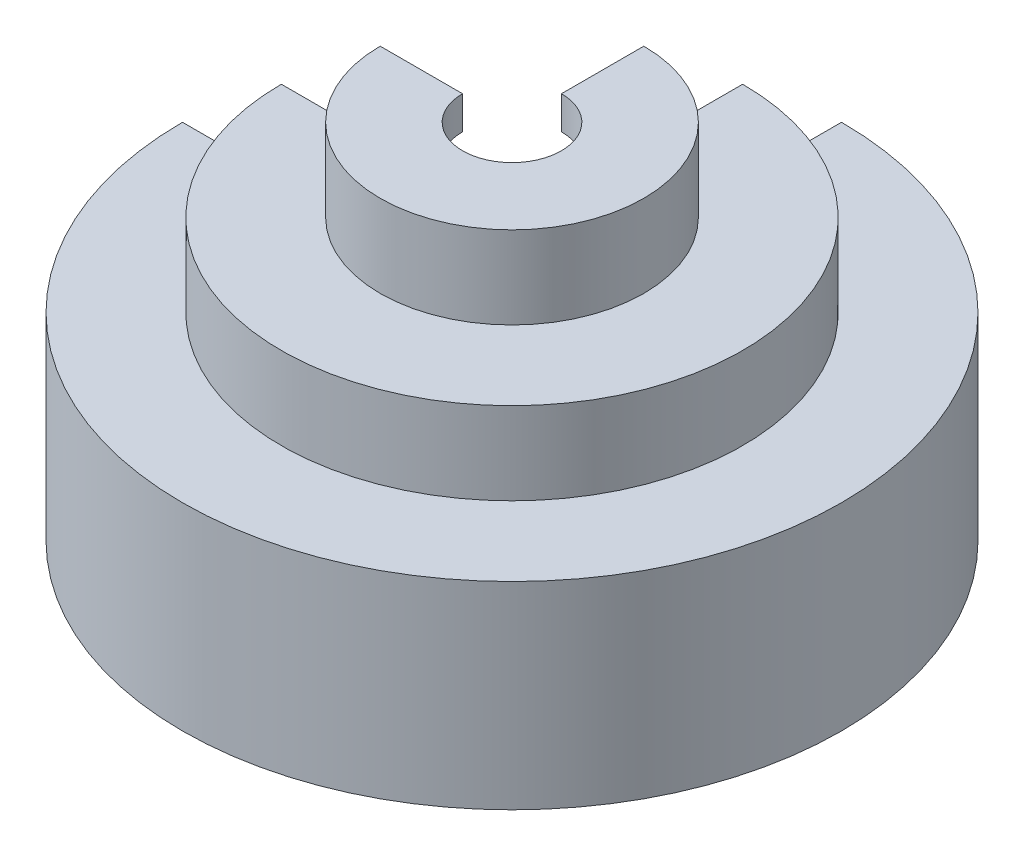
ISO-10303-21;
HEADER;
FILE_DESCRIPTION(('STEP AP214'),'2;1');
FILE_NAME('part.step','',(''),(''),'','','');
FILE_SCHEMA(('AUTOMOTIVE_DESIGN { 1 0 10303 214 1 1 1 1 }'));
ENDSEC;
DATA;
#1=APPLICATION_CONTEXT('core data for automotive mechanical design processes');
#2=APPLICATION_PROTOCOL_DEFINITION('international standard','automotive_design',2000,#1);
#3=PRODUCT_CONTEXT('',#1,'mechanical');
#4=PRODUCT('Part','Part','',(#3));
#5=PRODUCT_RELATED_PRODUCT_CATEGORY('part','',(#4));
#6=PRODUCT_DEFINITION_FORMATION('','',#4);
#7=PRODUCT_DEFINITION_CONTEXT('part definition',#1,'design');
#8=PRODUCT_DEFINITION('design','',#6,#7);
#9=PRODUCT_DEFINITION_SHAPE('','',#8);
#10=(LENGTH_UNIT() NAMED_UNIT(*) SI_UNIT(.MILLI.,.METRE.));
#11=(NAMED_UNIT(*) PLANE_ANGLE_UNIT() SI_UNIT($,.RADIAN.));
#12=(NAMED_UNIT(*) SI_UNIT($,.STERADIAN.) SOLID_ANGLE_UNIT());
#13=UNCERTAINTY_MEASURE_WITH_UNIT(LENGTH_MEASURE(1.E-05),#10,'distance_accuracy_value','');
#14=(GEOMETRIC_REPRESENTATION_CONTEXT(3) GLOBAL_UNCERTAINTY_ASSIGNED_CONTEXT((#13)) GLOBAL_UNIT_ASSIGNED_CONTEXT((#10,
#11,#12)) REPRESENTATION_CONTEXT('',''));
#15=CARTESIAN_POINT('',(0.,0.,0.));
#16=DIRECTION('',(0.,0.,1.));
#17=DIRECTION('',(1.,0.,0.));
#18=AXIS2_PLACEMENT_3D('',#15,#16,#17);
#19=CARTESIAN_POINT('',(0.,-150.,0.));
#20=DIRECTION('',(0.,-1.,0.));
#21=DIRECTION('',(0.,0.,-1.));
#22=AXIS2_PLACEMENT_3D('',#19,#20,#21);
#23=CYLINDRICAL_SURFACE('',#22,30.);
#24=CARTESIAN_POINT('',(0.,150.,0.));
#25=DIRECTION('',(0.,-1.,0.));
#26=DIRECTION('',(0.,0.,-1.));
#27=AXIS2_PLACEMENT_3D('',#24,#25,#26);
#28=CIRCLE('',#27,30.);
#29=CARTESIAN_POINT('',(0.,150.,-30.));
#30=VERTEX_POINT('',#29);
#31=CARTESIAN_POINT('',(-30.,150.,0.));
#32=VERTEX_POINT('',#31);
#33=EDGE_CURVE('E172',#30,#32,#28,.T.);
#34=ORIENTED_EDGE('',*,*,#33,.F.);
#35=DIRECTION('',(0.,-1.,0.));
#36=VECTOR('',#35,1.);
#37=CARTESIAN_POINT('',(0.,-150.,-30.));
#38=LINE('',#37,#36);
#39=CARTESIAN_POINT('',(0.,130.,-30.));
#40=VERTEX_POINT('',#39);
#41=EDGE_CURVE('E196',#30,#40,#38,.T.);
#42=ORIENTED_EDGE('',*,*,#41,.T.);
#43=CARTESIAN_POINT('',(0.,130.,0.));
#44=DIRECTION('',(0.,-1.,0.));
#45=DIRECTION('',(0.,0.,-1.));
#46=AXIS2_PLACEMENT_3D('',#43,#44,#45);
#47=CIRCLE('',#46,30.);
#48=CARTESIAN_POINT('',(-30.,130.,0.));
#49=VERTEX_POINT('',#48);
#50=EDGE_CURVE('E190',#40,#49,#47,.T.);
#51=ORIENTED_EDGE('',*,*,#50,.T.);
#52=DIRECTION('',(0.,-1.,0.));
#53=VECTOR('',#52,1.);
#54=CARTESIAN_POINT('',(-30.,-150.,0.));
#55=LINE('',#54,#53);
#56=EDGE_CURVE('E54',#49,#32,#55,.F.);
#57=ORIENTED_EDGE('',*,*,#56,.T.);
#58=EDGE_LOOP('',(#34,#42,#51,#57));
#59=FACE_BOUND('',#58,.T.);
#60=ADVANCED_FACE('F33',(#59),#23,.F.);
#61=CARTESIAN_POINT('',(-30.,150.,0.));
#62=DIRECTION('',(0.,-1.,0.));
#63=DIRECTION('',(0.,0.,-1.));
#64=AXIS2_PLACEMENT_3D('',#61,#62,#63);
#65=PLANE('',#64);
#66=CARTESIAN_POINT('',(0.,150.,0.));
#67=DIRECTION('',(0.,-1.,0.));
#68=DIRECTION('',(0.,0.,-1.));
#69=AXIS2_PLACEMENT_3D('',#66,#67,#68);
#70=CIRCLE('',#69,80.);
#71=CARTESIAN_POINT('',(0.,150.,-80.));
#72=VERTEX_POINT('',#71);
#73=CARTESIAN_POINT('',(-80.,150.,0.));
#74=VERTEX_POINT('',#73);
#75=EDGE_CURVE('E170',#72,#74,#70,.T.);
#76=ORIENTED_EDGE('',*,*,#75,.F.);
#77=DIRECTION('',(0.,0.,-1.));
#78=VECTOR('',#77,1.);
#79=CARTESIAN_POINT('',(0.,150.,-207.466179174207));
#80=LINE('',#79,#78);
#81=EDGE_CURVE('E174',#30,#72,#80,.T.);
#82=ORIENTED_EDGE('',*,*,#81,.F.);
#83=ORIENTED_EDGE('',*,*,#33,.T.);
#84=DIRECTION('',(1.,0.,0.));
#85=VECTOR('',#84,1.);
#86=CARTESIAN_POINT('',(0.,150.,0.));
#87=LINE('',#86,#85);
#88=EDGE_CURVE('E157',#74,#32,#87,.T.);
#89=ORIENTED_EDGE('',*,*,#88,.F.);
#90=EDGE_LOOP('',(#76,#82,#83,#89));
#91=FACE_BOUND('',#90,.T.);
#92=ADVANCED_FACE('F168',(#91),#65,.F.);
#93=CARTESIAN_POINT('',(0.,-150.,0.));
#94=DIRECTION('',(0.,-1.,0.));
#95=DIRECTION('',(0.,0.,-1.));
#96=AXIS2_PLACEMENT_3D('',#93,#94,#95);
#97=CYLINDRICAL_SURFACE('',#96,80.);
#98=CARTESIAN_POINT('',(0.,100.,0.));
#99=DIRECTION('',(0.,-1.,0.));
#100=DIRECTION('',(0.,0.,-1.));
#101=AXIS2_PLACEMENT_3D('',#98,#99,#100);
#102=CIRCLE('',#101,80.);
#103=CARTESIAN_POINT('',(0.,100.,-80.));
#104=VERTEX_POINT('',#103);
#105=CARTESIAN_POINT('',(-80.,100.,0.));
#106=VERTEX_POINT('',#105);
#107=EDGE_CURVE('E179',#104,#106,#102,.T.);
#108=ORIENTED_EDGE('',*,*,#107,.F.);
#109=DIRECTION('',(0.,-1.,0.));
#110=VECTOR('',#109,1.);
#111=CARTESIAN_POINT('',(0.,-150.,-80.));
#112=LINE('',#111,#110);
#113=EDGE_CURVE('E178',#104,#72,#112,.F.);
#114=ORIENTED_EDGE('',*,*,#113,.T.);
#115=ORIENTED_EDGE('',*,*,#75,.T.);
#116=DIRECTION('',(0.,-1.,0.));
#117=VECTOR('',#116,1.);
#118=CARTESIAN_POINT('',(-80.,-150.,0.));
#119=LINE('',#118,#117);
#120=EDGE_CURVE('E154',#74,#106,#119,.T.);
#121=ORIENTED_EDGE('',*,*,#120,.T.);
#122=EDGE_LOOP('',(#108,#114,#115,#121));
#123=FACE_BOUND('',#122,.T.);
#124=ADVANCED_FACE('F177',(#123),#97,.T.);
#125=CARTESIAN_POINT('',(-80.,100.,0.));
#126=DIRECTION('',(0.,-1.,0.));
#127=DIRECTION('',(0.,0.,-1.));
#128=AXIS2_PLACEMENT_3D('',#125,#126,#127);
#129=PLANE('',#128);
#130=CARTESIAN_POINT('',(0.,100.,0.));
#131=DIRECTION('',(0.,-1.,0.));
#132=DIRECTION('',(0.,0.,-1.));
#133=AXIS2_PLACEMENT_3D('',#130,#131,#132);
#134=CIRCLE('',#133,140.);
#135=CARTESIAN_POINT('',(0.,100.,-140.));
#136=VERTEX_POINT('',#135);
#137=CARTESIAN_POINT('',(-140.,100.,0.));
#138=VERTEX_POINT('',#137);
#139=EDGE_CURVE('E182',#136,#138,#134,.T.);
#140=ORIENTED_EDGE('',*,*,#139,.F.);
#141=DIRECTION('',(0.,0.,1.));
#142=VECTOR('',#141,1.);
#143=CARTESIAN_POINT('',(0.,100.,0.));
#144=LINE('',#143,#142);
#145=EDGE_CURVE('E200',#136,#104,#144,.T.);
#146=ORIENTED_EDGE('',*,*,#145,.T.);
#147=ORIENTED_EDGE('',*,*,#107,.T.);
#148=DIRECTION('',(-1.,0.,0.));
#149=VECTOR('',#148,1.);
#150=CARTESIAN_POINT('',(-80.,100.,0.));
#151=LINE('',#150,#149);
#152=EDGE_CURVE('E159',#106,#138,#151,.T.);
#153=ORIENTED_EDGE('',*,*,#152,.T.);
#154=EDGE_LOOP('',(#140,#146,#147,#153));
#155=FACE_BOUND('',#154,.T.);
#156=ADVANCED_FACE('F249',(#155),#129,.F.);
#157=CARTESIAN_POINT('',(0.,-150.,0.));
#158=DIRECTION('',(0.,-1.,0.));
#159=DIRECTION('',(0.,0.,-1.));
#160=AXIS2_PLACEMENT_3D('',#157,#158,#159);
#161=CYLINDRICAL_SURFACE('',#160,140.);
#162=CARTESIAN_POINT('',(0.,50.,0.));
#163=DIRECTION('',(0.,-1.,0.));
#164=DIRECTION('',(0.,0.,-1.));
#165=AXIS2_PLACEMENT_3D('',#162,#163,#164);
#166=CIRCLE('',#165,140.);
#167=CARTESIAN_POINT('',(0.,50.,-140.));
#168=VERTEX_POINT('',#167);
#169=CARTESIAN_POINT('',(-140.,50.,0.));
#170=VERTEX_POINT('',#169);
#171=EDGE_CURVE('E236',#168,#170,#166,.T.);
#172=ORIENTED_EDGE('',*,*,#171,.F.);
#173=DIRECTION('',(0.,-1.,0.));
#174=VECTOR('',#173,1.);
#175=CARTESIAN_POINT('',(0.,-150.,-140.));
#176=LINE('',#175,#174);
#177=EDGE_CURVE('E246',#168,#136,#176,.F.);
#178=ORIENTED_EDGE('',*,*,#177,.T.);
#179=ORIENTED_EDGE('',*,*,#139,.T.);
#180=DIRECTION('',(0.,-1.,0.));
#181=VECTOR('',#180,1.);
#182=CARTESIAN_POINT('',(-140.,-150.,0.));
#183=LINE('',#182,#181);
#184=EDGE_CURVE('E245',#138,#170,#183,.T.);
#185=ORIENTED_EDGE('',*,*,#184,.T.);
#186=EDGE_LOOP('',(#172,#178,#179,#185));
#187=FACE_BOUND('',#186,.T.);
#188=ADVANCED_FACE('F244',(#187),#161,.T.);
#189=CARTESIAN_POINT('',(-140.,50.,0.));
#190=DIRECTION('',(0.,-1.,0.));
#191=DIRECTION('',(0.,0.,-1.));
#192=AXIS2_PLACEMENT_3D('',#189,#190,#191);
#193=PLANE('',#192);
#194=CARTESIAN_POINT('',(0.,50.,0.));
#195=DIRECTION('',(0.,-1.,0.));
#196=DIRECTION('',(0.,0.,-1.));
#197=AXIS2_PLACEMENT_3D('',#194,#195,#196);
#198=CIRCLE('',#197,200.);
#199=CARTESIAN_POINT('',(0.,50.,-200.));
#200=VERTEX_POINT('',#199);
#201=CARTESIAN_POINT('',(-200.,50.,0.));
#202=VERTEX_POINT('',#201);
#203=EDGE_CURVE('E233',#200,#202,#198,.T.);
#204=ORIENTED_EDGE('',*,*,#203,.F.);
#205=DIRECTION('',(0.,0.,1.));
#206=VECTOR('',#205,1.);
#207=CARTESIAN_POINT('',(0.,50.,0.));
#208=LINE('',#207,#206);
#209=EDGE_CURVE('E284',#200,#168,#208,.T.);
#210=ORIENTED_EDGE('',*,*,#209,.T.);
#211=ORIENTED_EDGE('',*,*,#171,.T.);
#212=DIRECTION('',(-1.,0.,0.));
#213=VECTOR('',#212,1.);
#214=CARTESIAN_POINT('',(-140.,50.,0.));
#215=LINE('',#214,#213);
#216=EDGE_CURVE('E251',#170,#202,#215,.T.);
#217=ORIENTED_EDGE('',*,*,#216,.T.);
#218=EDGE_LOOP('',(#204,#210,#211,#217));
#219=FACE_BOUND('',#218,.T.);
#220=ADVANCED_FACE('F289',(#219),#193,.F.);
#221=CARTESIAN_POINT('',(0.,-150.,0.));
#222=DIRECTION('',(0.,-1.,0.));
#223=DIRECTION('',(0.,0.,-1.));
#224=AXIS2_PLACEMENT_3D('',#221,#222,#223);
#225=CYLINDRICAL_SURFACE('',#224,200.);
#226=CARTESIAN_POINT('',(0.,-70.,0.));
#227=DIRECTION('',(0.,-1.,0.));
#228=DIRECTION('',(0.,0.,-1.));
#229=AXIS2_PLACEMENT_3D('',#226,#227,#228);
#230=CIRCLE('',#229,200.);
#231=CARTESIAN_POINT('',(0.,-70.,-200.));
#232=VERTEX_POINT('',#231);
#233=CARTESIAN_POINT('',(-200.,-70.,0.));
#234=VERTEX_POINT('',#233);
#235=EDGE_CURVE('E230',#232,#234,#230,.T.);
#236=ORIENTED_EDGE('',*,*,#235,.F.);
#237=DIRECTION('',(0.,-1.,0.));
#238=VECTOR('',#237,1.);
#239=CARTESIAN_POINT('',(0.,-150.,-200.));
#240=LINE('',#239,#238);
#241=EDGE_CURVE('E281',#232,#200,#240,.F.);
#242=ORIENTED_EDGE('',*,*,#241,.T.);
#243=ORIENTED_EDGE('',*,*,#203,.T.);
#244=DIRECTION('',(0.,-1.,0.));
#245=VECTOR('',#244,1.);
#246=CARTESIAN_POINT('',(-200.,-150.,0.));
#247=LINE('',#246,#245);
#248=EDGE_CURVE('E296',#202,#234,#247,.T.);
#249=ORIENTED_EDGE('',*,*,#248,.T.);
#250=EDGE_LOOP('',(#236,#242,#243,#249));
#251=FACE_BOUND('',#250,.T.);
#252=ADVANCED_FACE('F294',(#251),#225,.T.);
#253=CARTESIAN_POINT('',(-200.,-70.,0.));
#254=DIRECTION('',(0.,1.,0.));
#255=DIRECTION('',(0.,0.,1.));
#256=AXIS2_PLACEMENT_3D('',#253,#254,#255);
#257=PLANE('',#256);
#258=CARTESIAN_POINT('',(0.,-70.,0.));
#259=DIRECTION('',(0.,-1.,0.));
#260=DIRECTION('',(0.,0.,-1.));
#261=AXIS2_PLACEMENT_3D('',#258,#259,#260);
#262=CIRCLE('',#261,80.);
#263=CARTESIAN_POINT('',(0.,-70.,-80.));
#264=VERTEX_POINT('',#263);
#265=CARTESIAN_POINT('',(-80.,-70.,0.));
#266=VERTEX_POINT('',#265);
#267=EDGE_CURVE('E227',#264,#266,#262,.T.);
#268=ORIENTED_EDGE('',*,*,#267,.F.);
#269=DIRECTION('',(0.,0.,-1.));
#270=VECTOR('',#269,1.);
#271=CARTESIAN_POINT('',(0.,-70.,0.));
#272=LINE('',#271,#270);
#273=EDGE_CURVE('E278',#264,#232,#272,.T.);
#274=ORIENTED_EDGE('',*,*,#273,.T.);
#275=ORIENTED_EDGE('',*,*,#235,.T.);
#276=DIRECTION('',(1.,0.,0.));
#277=VECTOR('',#276,1.);
#278=CARTESIAN_POINT('',(-200.,-70.,0.));
#279=LINE('',#278,#277);
#280=EDGE_CURVE('E301',#234,#266,#279,.T.);
#281=ORIENTED_EDGE('',*,*,#280,.T.);
#282=EDGE_LOOP('',(#268,#274,#275,#281));
#283=FACE_BOUND('',#282,.T.);
#284=ADVANCED_FACE('F300',(#283),#257,.F.);
#285=CARTESIAN_POINT('',(0.,-150.,0.));
#286=DIRECTION('',(0.,-1.,0.));
#287=DIRECTION('',(0.,0.,-1.));
#288=AXIS2_PLACEMENT_3D('',#285,#286,#287);
#289=CYLINDRICAL_SURFACE('',#288,80.);
#290=CARTESIAN_POINT('',(0.,-150.,0.));
#291=DIRECTION('',(0.,-1.,0.));
#292=DIRECTION('',(0.,0.,-1.));
#293=AXIS2_PLACEMENT_3D('',#290,#291,#292);
#294=CIRCLE('',#293,80.);
#295=CARTESIAN_POINT('',(0.,-150.,-80.));
#296=VERTEX_POINT('',#295);
#297=CARTESIAN_POINT('',(-80.,-150.,0.));
#298=VERTEX_POINT('',#297);
#299=EDGE_CURVE('E224',#296,#298,#294,.T.);
#300=ORIENTED_EDGE('',*,*,#299,.F.);
#301=DIRECTION('',(0.,-1.,0.));
#302=VECTOR('',#301,1.);
#303=CARTESIAN_POINT('',(0.,-150.,-80.));
#304=LINE('',#303,#302);
#305=EDGE_CURVE('E275',#296,#264,#304,.F.);
#306=ORIENTED_EDGE('',*,*,#305,.T.);
#307=ORIENTED_EDGE('',*,*,#267,.T.);
#308=DIRECTION('',(0.,-1.,0.));
#309=VECTOR('',#308,1.);
#310=CARTESIAN_POINT('',(-80.,-150.,0.));
#311=LINE('',#310,#309);
#312=EDGE_CURVE('E307',#266,#298,#311,.T.);
#313=ORIENTED_EDGE('',*,*,#312,.T.);
#314=EDGE_LOOP('',(#300,#306,#307,#313));
#315=FACE_BOUND('',#314,.T.);
#316=ADVANCED_FACE('F305',(#315),#289,.T.);
#317=CARTESIAN_POINT('',(-80.,-150.,0.));
#318=DIRECTION('',(0.,1.,0.));
#319=DIRECTION('',(0.,0.,1.));
#320=AXIS2_PLACEMENT_3D('',#317,#318,#319);
#321=PLANE('',#320);
#322=CARTESIAN_POINT('',(0.,-150.,0.));
#323=DIRECTION('',(0.,-1.,0.));
#324=DIRECTION('',(0.,0.,-1.));
#325=AXIS2_PLACEMENT_3D('',#322,#323,#324);
#326=CIRCLE('',#325,40.);
#327=CARTESIAN_POINT('',(0.,-150.,-40.));
#328=VERTEX_POINT('',#327);
#329=CARTESIAN_POINT('',(-40.,-150.,0.));
#330=VERTEX_POINT('',#329);
#331=EDGE_CURVE('E221',#328,#330,#326,.T.);
#332=ORIENTED_EDGE('',*,*,#331,.F.);
#333=DIRECTION('',(0.,0.,-1.));
#334=VECTOR('',#333,1.);
#335=CARTESIAN_POINT('',(0.,-150.,-207.466179174207));
#336=LINE('',#335,#334);
#337=EDGE_CURVE('E173',#328,#296,#336,.T.);
#338=ORIENTED_EDGE('',*,*,#337,.T.);
#339=ORIENTED_EDGE('',*,*,#299,.T.);
#340=DIRECTION('',(1.,0.,0.));
#341=VECTOR('',#340,1.);
#342=CARTESIAN_POINT('',(0.,-150.,0.));
#343=LINE('',#342,#341);
#344=EDGE_CURVE('E312',#298,#330,#343,.T.);
#345=ORIENTED_EDGE('',*,*,#344,.T.);
#346=EDGE_LOOP('',(#332,#338,#339,#345));
#347=FACE_BOUND('',#346,.T.);
#348=ADVANCED_FACE('F311',(#347),#321,.F.);
#349=CARTESIAN_POINT('',(0.,-150.,0.));
#350=DIRECTION('',(0.,-1.,0.));
#351=DIRECTION('',(0.,0.,-1.));
#352=AXIS2_PLACEMENT_3D('',#349,#350,#351);
#353=CYLINDRICAL_SURFACE('',#352,40.);
#354=CARTESIAN_POINT('',(0.,-30.,0.));
#355=DIRECTION('',(0.,-1.,0.));
#356=DIRECTION('',(0.,0.,-1.));
#357=AXIS2_PLACEMENT_3D('',#354,#355,#356);
#358=CIRCLE('',#357,40.);
#359=CARTESIAN_POINT('',(0.,-30.,-40.));
#360=VERTEX_POINT('',#359);
#361=CARTESIAN_POINT('',(-40.,-30.,0.));
#362=VERTEX_POINT('',#361);
#363=EDGE_CURVE('E218',#360,#362,#358,.T.);
#364=ORIENTED_EDGE('',*,*,#363,.F.);
#365=DIRECTION('',(0.,-1.,0.));
#366=VECTOR('',#365,1.);
#367=CARTESIAN_POINT('',(0.,-150.,-40.));
#368=LINE('',#367,#366);
#369=EDGE_CURVE('E271',#360,#328,#368,.T.);
#370=ORIENTED_EDGE('',*,*,#369,.T.);
#371=ORIENTED_EDGE('',*,*,#331,.T.);
#372=DIRECTION('',(0.,-1.,0.));
#373=VECTOR('',#372,1.);
#374=CARTESIAN_POINT('',(-40.,-150.,0.));
#375=LINE('',#374,#373);
#376=EDGE_CURVE('E334',#330,#362,#375,.F.);
#377=ORIENTED_EDGE('',*,*,#376,.T.);
#378=EDGE_LOOP('',(#364,#370,#371,#377));
#379=FACE_BOUND('',#378,.T.);
#380=ADVANCED_FACE('F342',(#379),#353,.F.);
#381=CARTESIAN_POINT('',(-40.,-30.,0.));
#382=DIRECTION('',(0.,-1.,0.));
#383=DIRECTION('',(0.,0.,-1.));
#384=AXIS2_PLACEMENT_3D('',#381,#382,#383);
#385=PLANE('',#384);
#386=CARTESIAN_POINT('',(0.,-30.,0.));
#387=DIRECTION('',(0.,-1.,0.));
#388=DIRECTION('',(0.,0.,-1.));
#389=AXIS2_PLACEMENT_3D('',#386,#387,#388);
#390=CIRCLE('',#389,140.);
#391=CARTESIAN_POINT('',(0.,-30.,-140.));
#392=VERTEX_POINT('',#391);
#393=CARTESIAN_POINT('',(-140.,-30.,0.));
#394=VERTEX_POINT('',#393);
#395=EDGE_CURVE('E215',#392,#394,#390,.T.);
#396=ORIENTED_EDGE('',*,*,#395,.F.);
#397=DIRECTION('',(0.,0.,1.));
#398=VECTOR('',#397,1.);
#399=CARTESIAN_POINT('',(0.,-30.,0.));
#400=LINE('',#399,#398);
#401=EDGE_CURVE('E268',#392,#360,#400,.T.);
#402=ORIENTED_EDGE('',*,*,#401,.T.);
#403=ORIENTED_EDGE('',*,*,#363,.T.);
#404=DIRECTION('',(-1.,0.,0.));
#405=VECTOR('',#404,1.);
#406=CARTESIAN_POINT('',(-40.,-30.,0.));
#407=LINE('',#406,#405);
#408=EDGE_CURVE('E331',#362,#394,#407,.T.);
#409=ORIENTED_EDGE('',*,*,#408,.T.);
#410=EDGE_LOOP('',(#396,#402,#403,#409));
#411=FACE_BOUND('',#410,.T.);
#412=ADVANCED_FACE('F345',(#411),#385,.F.);
#413=CARTESIAN_POINT('',(0.,-150.,0.));
#414=DIRECTION('',(0.,-1.,0.));
#415=DIRECTION('',(0.,0.,-1.));
#416=AXIS2_PLACEMENT_3D('',#413,#414,#415);
#417=CYLINDRICAL_SURFACE('',#416,140.);
#418=CARTESIAN_POINT('',(0.,30.,0.));
#419=DIRECTION('',(0.,-1.,0.));
#420=DIRECTION('',(0.,0.,-1.));
#421=AXIS2_PLACEMENT_3D('',#418,#419,#420);
#422=CIRCLE('',#421,140.);
#423=CARTESIAN_POINT('',(0.,30.,-140.));
#424=VERTEX_POINT('',#423);
#425=CARTESIAN_POINT('',(-140.,30.,0.));
#426=VERTEX_POINT('',#425);
#427=EDGE_CURVE('E212',#424,#426,#422,.T.);
#428=ORIENTED_EDGE('',*,*,#427,.F.);
#429=DIRECTION('',(0.,-1.,0.));
#430=VECTOR('',#429,1.);
#431=CARTESIAN_POINT('',(0.,-150.,-140.));
#432=LINE('',#431,#430);
#433=EDGE_CURVE('E265',#424,#392,#432,.T.);
#434=ORIENTED_EDGE('',*,*,#433,.T.);
#435=ORIENTED_EDGE('',*,*,#395,.T.);
#436=DIRECTION('',(0.,-1.,0.));
#437=VECTOR('',#436,1.);
#438=CARTESIAN_POINT('',(-140.,-150.,0.));
#439=LINE('',#438,#437);
#440=EDGE_CURVE('E328',#394,#426,#439,.F.);
#441=ORIENTED_EDGE('',*,*,#440,.T.);
#442=EDGE_LOOP('',(#428,#434,#435,#441));
#443=FACE_BOUND('',#442,.T.);
#444=ADVANCED_FACE('F348',(#443),#417,.F.);
#445=CARTESIAN_POINT('',(-140.,30.,0.));
#446=DIRECTION('',(0.,1.,0.));
#447=DIRECTION('',(0.,0.,1.));
#448=AXIS2_PLACEMENT_3D('',#445,#446,#447);
#449=PLANE('',#448);
#450=CARTESIAN_POINT('',(0.,30.,0.));
#451=DIRECTION('',(0.,-1.,0.));
#452=DIRECTION('',(0.,0.,-1.));
#453=AXIS2_PLACEMENT_3D('',#450,#451,#452);
#454=CIRCLE('',#453,80.);
#455=CARTESIAN_POINT('',(0.,30.,-80.));
#456=VERTEX_POINT('',#455);
#457=CARTESIAN_POINT('',(-80.,30.,0.));
#458=VERTEX_POINT('',#457);
#459=EDGE_CURVE('E209',#456,#458,#454,.T.);
#460=ORIENTED_EDGE('',*,*,#459,.F.);
#461=DIRECTION('',(0.,0.,-1.));
#462=VECTOR('',#461,1.);
#463=CARTESIAN_POINT('',(0.,30.,0.));
#464=LINE('',#463,#462);
#465=EDGE_CURVE('E262',#456,#424,#464,.T.);
#466=ORIENTED_EDGE('',*,*,#465,.T.);
#467=ORIENTED_EDGE('',*,*,#427,.T.);
#468=DIRECTION('',(1.,0.,0.));
#469=VECTOR('',#468,1.);
#470=CARTESIAN_POINT('',(-140.,30.,0.));
#471=LINE('',#470,#469);
#472=EDGE_CURVE('E325',#426,#458,#471,.T.);
#473=ORIENTED_EDGE('',*,*,#472,.T.);
#474=EDGE_LOOP('',(#460,#466,#467,#473));
#475=FACE_BOUND('',#474,.T.);
#476=ADVANCED_FACE('F351',(#475),#449,.F.);
#477=CARTESIAN_POINT('',(0.,-150.,0.));
#478=DIRECTION('',(0.,-1.,0.));
#479=DIRECTION('',(0.,0.,-1.));
#480=AXIS2_PLACEMENT_3D('',#477,#478,#479);
#481=CYLINDRICAL_SURFACE('',#480,80.);
#482=CARTESIAN_POINT('',(0.,80.,0.));
#483=DIRECTION('',(0.,-1.,0.));
#484=DIRECTION('',(0.,0.,-1.));
#485=AXIS2_PLACEMENT_3D('',#482,#483,#484);
#486=CIRCLE('',#485,80.);
#487=CARTESIAN_POINT('',(0.,80.,-80.));
#488=VERTEX_POINT('',#487);
#489=CARTESIAN_POINT('',(-80.,80.,0.));
#490=VERTEX_POINT('',#489);
#491=EDGE_CURVE('E206',#488,#490,#486,.T.);
#492=ORIENTED_EDGE('',*,*,#491,.F.);
#493=DIRECTION('',(0.,-1.,0.));
#494=VECTOR('',#493,1.);
#495=CARTESIAN_POINT('',(0.,-150.,-80.));
#496=LINE('',#495,#494);
#497=EDGE_CURVE('E259',#488,#456,#496,.T.);
#498=ORIENTED_EDGE('',*,*,#497,.T.);
#499=ORIENTED_EDGE('',*,*,#459,.T.);
#500=DIRECTION('',(0.,-1.,0.));
#501=VECTOR('',#500,1.);
#502=CARTESIAN_POINT('',(-80.,-150.,0.));
#503=LINE('',#502,#501);
#504=EDGE_CURVE('E322',#458,#490,#503,.F.);
#505=ORIENTED_EDGE('',*,*,#504,.T.);
#506=EDGE_LOOP('',(#492,#498,#499,#505));
#507=FACE_BOUND('',#506,.T.);
#508=ADVANCED_FACE('F354',(#507),#481,.F.);
#509=CARTESIAN_POINT('',(-80.,80.,0.));
#510=DIRECTION('',(0.,1.,0.));
#511=DIRECTION('',(0.,0.,1.));
#512=AXIS2_PLACEMENT_3D('',#509,#510,#511);
#513=PLANE('',#512);
#514=CARTESIAN_POINT('',(0.,80.,0.));
#515=DIRECTION('',(0.,-1.,0.));
#516=DIRECTION('',(0.,0.,-1.));
#517=AXIS2_PLACEMENT_3D('',#514,#515,#516);
#518=CIRCLE('',#517,50.);
#519=CARTESIAN_POINT('',(0.,80.,-50.));
#520=VERTEX_POINT('',#519);
#521=CARTESIAN_POINT('',(-50.,80.,0.));
#522=VERTEX_POINT('',#521);
#523=EDGE_CURVE('E198',#520,#522,#518,.T.);
#524=ORIENTED_EDGE('',*,*,#523,.F.);
#525=DIRECTION('',(0.,0.,-1.));
#526=VECTOR('',#525,1.);
#527=CARTESIAN_POINT('',(0.,80.,0.));
#528=LINE('',#527,#526);
#529=EDGE_CURVE('E256',#520,#488,#528,.T.);
#530=ORIENTED_EDGE('',*,*,#529,.T.);
#531=ORIENTED_EDGE('',*,*,#491,.T.);
#532=DIRECTION('',(1.,0.,0.));
#533=VECTOR('',#532,1.);
#534=CARTESIAN_POINT('',(-80.,80.,0.));
#535=LINE('',#534,#533);
#536=EDGE_CURVE('E319',#490,#522,#535,.T.);
#537=ORIENTED_EDGE('',*,*,#536,.T.);
#538=EDGE_LOOP('',(#524,#530,#531,#537));
#539=FACE_BOUND('',#538,.T.);
#540=ADVANCED_FACE('F357',(#539),#513,.F.);
#541=CARTESIAN_POINT('',(0.,-150.,0.));
#542=DIRECTION('',(0.,-1.,0.));
#543=DIRECTION('',(0.,0.,-1.));
#544=AXIS2_PLACEMENT_3D('',#541,#542,#543);
#545=CYLINDRICAL_SURFACE('',#544,50.);
#546=CARTESIAN_POINT('',(0.,130.,0.));
#547=DIRECTION('',(0.,-1.,0.));
#548=DIRECTION('',(0.,0.,-1.));
#549=AXIS2_PLACEMENT_3D('',#546,#547,#548);
#550=CIRCLE('',#549,50.);
#551=CARTESIAN_POINT('',(0.,130.,-50.));
#552=VERTEX_POINT('',#551);
#553=CARTESIAN_POINT('',(-50.,130.,0.));
#554=VERTEX_POINT('',#553);
#555=EDGE_CURVE('E192',#552,#554,#550,.T.);
#556=ORIENTED_EDGE('',*,*,#555,.F.);
#557=DIRECTION('',(0.,-1.,0.));
#558=VECTOR('',#557,1.);
#559=CARTESIAN_POINT('',(0.,-150.,-50.));
#560=LINE('',#559,#558);
#561=EDGE_CURVE('E47',#552,#520,#560,.T.);
#562=ORIENTED_EDGE('',*,*,#561,.T.);
#563=ORIENTED_EDGE('',*,*,#523,.T.);
#564=DIRECTION('',(0.,-1.,0.));
#565=VECTOR('',#564,1.);
#566=CARTESIAN_POINT('',(-50.,-150.,0.));
#567=LINE('',#566,#565);
#568=EDGE_CURVE('E314',#522,#554,#567,.F.);
#569=ORIENTED_EDGE('',*,*,#568,.T.);
#570=EDGE_LOOP('',(#556,#562,#563,#569));
#571=FACE_BOUND('',#570,.T.);
#572=ADVANCED_FACE('F359',(#571),#545,.F.);
#573=CARTESIAN_POINT('',(-50.,130.,0.));
#574=DIRECTION('',(0.,1.,0.));
#575=DIRECTION('',(0.,0.,1.));
#576=AXIS2_PLACEMENT_3D('',#573,#574,#575);
#577=PLANE('',#576);
#578=ORIENTED_EDGE('',*,*,#50,.F.);
#579=DIRECTION('',(0.,0.,-1.));
#580=VECTOR('',#579,1.);
#581=CARTESIAN_POINT('',(0.,130.,0.));
#582=LINE('',#581,#580);
#583=EDGE_CURVE('E11',#40,#552,#582,.T.);
#584=ORIENTED_EDGE('',*,*,#583,.T.);
#585=ORIENTED_EDGE('',*,*,#555,.T.);
#586=DIRECTION('',(1.,0.,0.));
#587=VECTOR('',#586,1.);
#588=CARTESIAN_POINT('',(-50.,130.,0.));
#589=LINE('',#588,#587);
#590=EDGE_CURVE('E40',#554,#49,#589,.T.);
#591=ORIENTED_EDGE('',*,*,#590,.T.);
#592=EDGE_LOOP('',(#578,#584,#585,#591));
#593=FACE_BOUND('',#592,.T.);
#594=ADVANCED_FACE('F189',(#593),#577,.F.);
#595=CARTESIAN_POINT('',(0.,-150.,0.));
#596=DIRECTION('',(0.,0.,1.));
#597=DIRECTION('',(1.,0.,0.));
#598=AXIS2_PLACEMENT_3D('',#595,#596,#597);
#599=PLANE('',#598);
#600=ORIENTED_EDGE('',*,*,#88,.T.);
#601=ORIENTED_EDGE('',*,*,#56,.F.);
#602=ORIENTED_EDGE('',*,*,#590,.F.);
#603=ORIENTED_EDGE('',*,*,#568,.F.);
#604=ORIENTED_EDGE('',*,*,#536,.F.);
#605=ORIENTED_EDGE('',*,*,#504,.F.);
#606=ORIENTED_EDGE('',*,*,#472,.F.);
#607=ORIENTED_EDGE('',*,*,#440,.F.);
#608=ORIENTED_EDGE('',*,*,#408,.F.);
#609=ORIENTED_EDGE('',*,*,#376,.F.);
#610=ORIENTED_EDGE('',*,*,#344,.F.);
#611=ORIENTED_EDGE('',*,*,#312,.F.);
#612=ORIENTED_EDGE('',*,*,#280,.F.);
#613=ORIENTED_EDGE('',*,*,#248,.F.);
#614=ORIENTED_EDGE('',*,*,#216,.F.);
#615=ORIENTED_EDGE('',*,*,#184,.F.);
#616=ORIENTED_EDGE('',*,*,#152,.F.);
#617=ORIENTED_EDGE('',*,*,#120,.F.);
#618=EDGE_LOOP('',(#600,#601,#602,#603,#604,#605,#606,#607,#608,#609,#610,#611,#612,#613,#614,
#615,#616,#617));
#619=FACE_BOUND('',#618,.T.);
#620=ADVANCED_FACE('F156',(#619),#599,.F.);
#621=CARTESIAN_POINT('',(0.,-150.,-207.466179174207));
#622=DIRECTION('',(1.,0.,0.));
#623=DIRECTION('',(0.,0.,-1.));
#624=AXIS2_PLACEMENT_3D('',#621,#622,#623);
#625=PLANE('',#624);
#626=ORIENTED_EDGE('',*,*,#145,.F.);
#627=ORIENTED_EDGE('',*,*,#177,.F.);
#628=ORIENTED_EDGE('',*,*,#209,.F.);
#629=ORIENTED_EDGE('',*,*,#241,.F.);
#630=ORIENTED_EDGE('',*,*,#273,.F.);
#631=ORIENTED_EDGE('',*,*,#305,.F.);
#632=ORIENTED_EDGE('',*,*,#337,.F.);
#633=ORIENTED_EDGE('',*,*,#369,.F.);
#634=ORIENTED_EDGE('',*,*,#401,.F.);
#635=ORIENTED_EDGE('',*,*,#433,.F.);
#636=ORIENTED_EDGE('',*,*,#465,.F.);
#637=ORIENTED_EDGE('',*,*,#497,.F.);
#638=ORIENTED_EDGE('',*,*,#529,.F.);
#639=ORIENTED_EDGE('',*,*,#561,.F.);
#640=ORIENTED_EDGE('',*,*,#583,.F.);
#641=ORIENTED_EDGE('',*,*,#41,.F.);
#642=ORIENTED_EDGE('',*,*,#81,.T.);
#643=ORIENTED_EDGE('',*,*,#113,.F.);
#644=EDGE_LOOP('',(#626,#627,#628,#629,#630,#631,#632,#633,#634,#635,#636,#637,#638,#639,#640,
#641,#642,#643));
#645=FACE_BOUND('',#644,.T.);
#646=ADVANCED_FACE('F291',(#645),#625,.F.);
#647=CLOSED_SHELL('',(#60,#92,#124,#156,#188,#220,#252,#284,#316,#348,#380,#412,#444,#476,#508,
#540,#572,#594,#620,#646));
#648=MANIFOLD_SOLID_BREP('B2',#647);
#649=ADVANCED_BREP_SHAPE_REPRESENTATION('',(#18,#648),#14);
#650=SHAPE_DEFINITION_REPRESENTATION(#9,#649);
ENDSEC;
END-ISO-10303-21;
